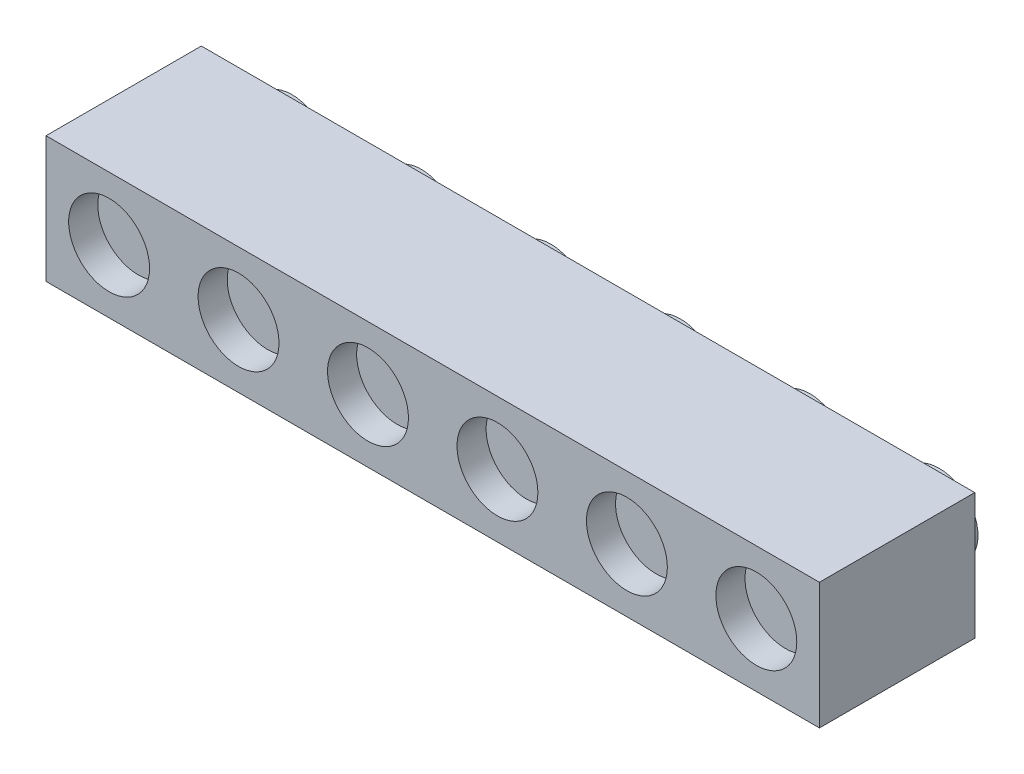
ISO-10303-21;
HEADER;
FILE_DESCRIPTION(('STEP AP214'),'2;1');
FILE_NAME('part.step','',(''),(''),'','','');
FILE_SCHEMA(('AUTOMOTIVE_DESIGN { 1 0 10303 214 1 1 1 1 }'));
ENDSEC;
DATA;
#1=APPLICATION_CONTEXT('core data for automotive mechanical design processes');
#2=APPLICATION_PROTOCOL_DEFINITION('international standard','automotive_design',2000,#1);
#3=PRODUCT_CONTEXT('',#1,'mechanical');
#4=PRODUCT('Part','Part','',(#3));
#5=PRODUCT_RELATED_PRODUCT_CATEGORY('part','',(#4));
#6=PRODUCT_DEFINITION_FORMATION('','',#4);
#7=PRODUCT_DEFINITION_CONTEXT('part definition',#1,'design');
#8=PRODUCT_DEFINITION('design','',#6,#7);
#9=PRODUCT_DEFINITION_SHAPE('','',#8);
#10=(LENGTH_UNIT() NAMED_UNIT(*) SI_UNIT(.MILLI.,.METRE.));
#11=(NAMED_UNIT(*) PLANE_ANGLE_UNIT() SI_UNIT($,.RADIAN.));
#12=(NAMED_UNIT(*) SI_UNIT($,.STERADIAN.) SOLID_ANGLE_UNIT());
#13=UNCERTAINTY_MEASURE_WITH_UNIT(LENGTH_MEASURE(1.E-05),#10,'distance_accuracy_value','');
#14=(GEOMETRIC_REPRESENTATION_CONTEXT(3) GLOBAL_UNCERTAINTY_ASSIGNED_CONTEXT((#13)) GLOBAL_UNIT_ASSIGNED_CONTEXT((#10,
#11,#12)) REPRESENTATION_CONTEXT('',''));
#15=CARTESIAN_POINT('',(0.,0.,0.));
#16=DIRECTION('',(0.,0.,1.));
#17=DIRECTION('',(1.,0.,0.));
#18=AXIS2_PLACEMENT_3D('',#15,#16,#17);
#19=CARTESIAN_POINT('',(-23.9,-3.9,9.6));
#20=DIRECTION('',(1.,0.,0.));
#21=DIRECTION('',(0.,0.,-1.));
#22=AXIS2_PLACEMENT_3D('',#19,#20,#21);
#23=PLANE('',#22);
#24=DIRECTION('',(0.,-1.,0.));
#25=VECTOR('',#24,1.);
#26=CARTESIAN_POINT('',(-23.9,-3.9,0.));
#27=LINE('',#26,#25);
#28=CARTESIAN_POINT('',(-23.9,3.9,0.));
#29=VERTEX_POINT('',#28);
#30=CARTESIAN_POINT('',(-23.9,-3.9,0.));
#31=VERTEX_POINT('',#30);
#32=EDGE_CURVE('E104',#29,#31,#27,.T.);
#33=ORIENTED_EDGE('',*,*,#32,.T.);
#34=DIRECTION('',(0.,0.,-1.));
#35=VECTOR('',#34,1.);
#36=CARTESIAN_POINT('',(-23.9,-3.9,9.6));
#37=LINE('',#36,#35);
#38=CARTESIAN_POINT('',(-23.9,-3.9,9.6));
#39=VERTEX_POINT('',#38);
#40=EDGE_CURVE('E95',#39,#31,#37,.T.);
#41=ORIENTED_EDGE('',*,*,#40,.F.);
#42=DIRECTION('',(0.,-1.,0.));
#43=VECTOR('',#42,1.);
#44=CARTESIAN_POINT('',(-23.9,-3.9,9.6));
#45=LINE('',#44,#43);
#46=CARTESIAN_POINT('',(-23.9,3.9,9.6));
#47=VERTEX_POINT('',#46);
#48=EDGE_CURVE('E89',#47,#39,#45,.T.);
#49=ORIENTED_EDGE('',*,*,#48,.F.);
#50=DIRECTION('',(0.,0.,-1.));
#51=VECTOR('',#50,1.);
#52=CARTESIAN_POINT('',(-23.9,3.9,9.6));
#53=LINE('',#52,#51);
#54=EDGE_CURVE('E100',#47,#29,#53,.T.);
#55=ORIENTED_EDGE('',*,*,#54,.T.);
#56=EDGE_LOOP('',(#33,#41,#49,#55));
#57=FACE_BOUND('',#56,.T.);
#58=ADVANCED_FACE('F37',(#57),#23,.F.);
#59=CARTESIAN_POINT('',(23.9,-3.9,9.6));
#60=DIRECTION('',(0.,1.,0.));
#61=DIRECTION('',(-1.,0.,0.));
#62=AXIS2_PLACEMENT_3D('',#59,#60,#61);
#63=PLANE('',#62);
#64=DIRECTION('',(1.,0.,0.));
#65=VECTOR('',#64,1.);
#66=CARTESIAN_POINT('',(23.9,-3.9,0.));
#67=LINE('',#66,#65);
#68=CARTESIAN_POINT('',(23.9,-3.9,0.));
#69=VERTEX_POINT('',#68);
#70=EDGE_CURVE('E94',#31,#69,#67,.T.);
#71=ORIENTED_EDGE('',*,*,#70,.T.);
#72=DIRECTION('',(0.,0.,-1.));
#73=VECTOR('',#72,1.);
#74=CARTESIAN_POINT('',(23.9,-3.9,9.6));
#75=LINE('',#74,#73);
#76=CARTESIAN_POINT('',(23.9,-3.9,9.6));
#77=VERTEX_POINT('',#76);
#78=EDGE_CURVE('E92',#77,#69,#75,.T.);
#79=ORIENTED_EDGE('',*,*,#78,.F.);
#80=DIRECTION('',(1.,0.,0.));
#81=VECTOR('',#80,1.);
#82=CARTESIAN_POINT('',(23.9,-3.9,9.6));
#83=LINE('',#82,#81);
#84=EDGE_CURVE('E84',#39,#77,#83,.T.);
#85=ORIENTED_EDGE('',*,*,#84,.F.);
#86=ORIENTED_EDGE('',*,*,#40,.T.);
#87=EDGE_LOOP('',(#71,#79,#85,#86));
#88=FACE_BOUND('',#87,.T.);
#89=ADVANCED_FACE('F93',(#88),#63,.F.);
#90=CARTESIAN_POINT('',(23.9,-3.9,9.6));
#91=DIRECTION('',(-1.,0.,0.));
#92=DIRECTION('',(0.,0.,1.));
#93=AXIS2_PLACEMENT_3D('',#90,#91,#92);
#94=PLANE('',#93);
#95=DIRECTION('',(0.,1.,0.));
#96=VECTOR('',#95,1.);
#97=CARTESIAN_POINT('',(23.9,-3.9,0.));
#98=LINE('',#97,#96);
#99=CARTESIAN_POINT('',(23.9,3.9,0.));
#100=VERTEX_POINT('',#99);
#101=EDGE_CURVE('E70',#69,#100,#98,.T.);
#102=ORIENTED_EDGE('',*,*,#101,.T.);
#103=DIRECTION('',(0.,0.,-1.));
#104=VECTOR('',#103,1.);
#105=CARTESIAN_POINT('',(23.9,3.9,9.6));
#106=LINE('',#105,#104);
#107=CARTESIAN_POINT('',(23.9,3.9,9.6));
#108=VERTEX_POINT('',#107);
#109=EDGE_CURVE('E96',#108,#100,#106,.T.);
#110=ORIENTED_EDGE('',*,*,#109,.F.);
#111=DIRECTION('',(0.,1.,0.));
#112=VECTOR('',#111,1.);
#113=CARTESIAN_POINT('',(23.9,-3.9,9.6));
#114=LINE('',#113,#112);
#115=EDGE_CURVE('E87',#77,#108,#114,.T.);
#116=ORIENTED_EDGE('',*,*,#115,.F.);
#117=ORIENTED_EDGE('',*,*,#78,.T.);
#118=EDGE_LOOP('',(#102,#110,#116,#117));
#119=FACE_BOUND('',#118,.T.);
#120=ADVANCED_FACE('F98',(#119),#94,.F.);
#121=CARTESIAN_POINT('',(23.9,3.9,9.6));
#122=DIRECTION('',(0.,-1.,0.));
#123=DIRECTION('',(1.,0.,0.));
#124=AXIS2_PLACEMENT_3D('',#121,#122,#123);
#125=PLANE('',#124);
#126=DIRECTION('',(-1.,0.,0.));
#127=VECTOR('',#126,1.);
#128=CARTESIAN_POINT('',(23.9,3.9,0.));
#129=LINE('',#128,#127);
#130=EDGE_CURVE('E76',#100,#29,#129,.T.);
#131=ORIENTED_EDGE('',*,*,#130,.T.);
#132=ORIENTED_EDGE('',*,*,#54,.F.);
#133=DIRECTION('',(-1.,0.,0.));
#134=VECTOR('',#133,1.);
#135=CARTESIAN_POINT('',(23.9,3.9,9.6));
#136=LINE('',#135,#134);
#137=EDGE_CURVE('E53',#108,#47,#136,.T.);
#138=ORIENTED_EDGE('',*,*,#137,.F.);
#139=ORIENTED_EDGE('',*,*,#109,.T.);
#140=EDGE_LOOP('',(#131,#132,#138,#139));
#141=FACE_BOUND('',#140,.T.);
#142=ADVANCED_FACE('F146',(#141),#125,.F.);
#143=CARTESIAN_POINT('',(0.,0.,9.6));
#144=DIRECTION('',(0.,0.,1.));
#145=DIRECTION('',(1.,0.,0.));
#146=AXIS2_PLACEMENT_3D('',#143,#144,#145);
#147=PLANE('',#146);
#148=CARTESIAN_POINT('',(-20.,0.,9.6));
#149=DIRECTION('',(0.,0.,1.));
#150=DIRECTION('',(1.,0.,0.));
#151=AXIS2_PLACEMENT_3D('',#148,#149,#150);
#152=CIRCLE('',#151,2.5);
#153=CARTESIAN_POINT('',(-17.5,0.,9.6));
#154=VERTEX_POINT('',#153);
#155=EDGE_CURVE('E428',#154,#154,#152,.T.);
#156=ORIENTED_EDGE('',*,*,#155,.F.);
#157=EDGE_LOOP('',(#156));
#158=FACE_BOUND('',#157,.T.);
#159=CARTESIAN_POINT('',(-12.,0.,9.6));
#160=DIRECTION('',(0.,0.,1.));
#161=DIRECTION('',(1.,0.,0.));
#162=AXIS2_PLACEMENT_3D('',#159,#160,#161);
#163=CIRCLE('',#162,2.5);
#164=CARTESIAN_POINT('',(-9.5,0.,9.6));
#165=VERTEX_POINT('',#164);
#166=EDGE_CURVE('E439',#165,#165,#163,.T.);
#167=ORIENTED_EDGE('',*,*,#166,.F.);
#168=EDGE_LOOP('',(#167));
#169=FACE_BOUND('',#168,.T.);
#170=CARTESIAN_POINT('',(-4.,0.,9.6));
#171=DIRECTION('',(0.,0.,1.));
#172=DIRECTION('',(1.,0.,0.));
#173=AXIS2_PLACEMENT_3D('',#170,#171,#172);
#174=CIRCLE('',#173,2.5);
#175=CARTESIAN_POINT('',(-1.5,0.,9.6));
#176=VERTEX_POINT('',#175);
#177=EDGE_CURVE('E445',#176,#176,#174,.T.);
#178=ORIENTED_EDGE('',*,*,#177,.F.);
#179=EDGE_LOOP('',(#178));
#180=FACE_BOUND('',#179,.T.);
#181=CARTESIAN_POINT('',(4.,0.,9.6));
#182=DIRECTION('',(0.,0.,1.));
#183=DIRECTION('',(1.,0.,0.));
#184=AXIS2_PLACEMENT_3D('',#181,#182,#183);
#185=CIRCLE('',#184,2.5);
#186=CARTESIAN_POINT('',(6.5,0.,9.6));
#187=VERTEX_POINT('',#186);
#188=EDGE_CURVE('E451',#187,#187,#185,.T.);
#189=ORIENTED_EDGE('',*,*,#188,.F.);
#190=EDGE_LOOP('',(#189));
#191=FACE_BOUND('',#190,.T.);
#192=CARTESIAN_POINT('',(12.,0.,9.6));
#193=DIRECTION('',(0.,0.,1.));
#194=DIRECTION('',(1.,0.,0.));
#195=AXIS2_PLACEMENT_3D('',#192,#193,#194);
#196=CIRCLE('',#195,2.5);
#197=CARTESIAN_POINT('',(14.5,0.,9.6));
#198=VERTEX_POINT('',#197);
#199=EDGE_CURVE('E457',#198,#198,#196,.T.);
#200=ORIENTED_EDGE('',*,*,#199,.F.);
#201=EDGE_LOOP('',(#200));
#202=FACE_BOUND('',#201,.T.);
#203=CARTESIAN_POINT('',(20.,0.,9.6));
#204=DIRECTION('',(0.,0.,1.));
#205=DIRECTION('',(1.,0.,0.));
#206=AXIS2_PLACEMENT_3D('',#203,#204,#205);
#207=CIRCLE('',#206,2.5);
#208=CARTESIAN_POINT('',(22.5,0.,9.6));
#209=VERTEX_POINT('',#208);
#210=EDGE_CURVE('E463',#209,#209,#207,.T.);
#211=ORIENTED_EDGE('',*,*,#210,.F.);
#212=EDGE_LOOP('',(#211));
#213=FACE_BOUND('',#212,.T.);
#214=ORIENTED_EDGE('',*,*,#48,.T.);
#215=ORIENTED_EDGE('',*,*,#84,.T.);
#216=ORIENTED_EDGE('',*,*,#115,.T.);
#217=ORIENTED_EDGE('',*,*,#137,.T.);
#218=EDGE_LOOP('',(#214,#215,#216,#217));
#219=FACE_BOUND('',#218,.T.);
#220=ADVANCED_FACE('F85',(#158,#169,#180,#191,#202,#213,#219),#147,.T.);
#221=CARTESIAN_POINT('',(0.,0.,0.));
#222=DIRECTION('',(0.,0.,1.));
#223=DIRECTION('',(1.,0.,0.));
#224=AXIS2_PLACEMENT_3D('',#221,#222,#223);
#225=PLANE('',#224);
#226=CARTESIAN_POINT('',(-20.,0.,0.));
#227=DIRECTION('',(0.,0.,1.));
#228=DIRECTION('',(1.,0.,0.));
#229=AXIS2_PLACEMENT_3D('',#226,#227,#228);
#230=CIRCLE('',#229,2.4);
#231=CARTESIAN_POINT('',(-17.6,0.,0.));
#232=VERTEX_POINT('',#231);
#233=EDGE_CURVE('E11',#232,#232,#230,.F.);
#234=ORIENTED_EDGE('',*,*,#233,.F.);
#235=EDGE_LOOP('',(#234));
#236=FACE_BOUND('',#235,.T.);
#237=CARTESIAN_POINT('',(-12.,0.,0.));
#238=DIRECTION('',(0.,0.,1.));
#239=DIRECTION('',(1.,0.,0.));
#240=AXIS2_PLACEMENT_3D('',#237,#238,#239);
#241=CIRCLE('',#240,2.4);
#242=CARTESIAN_POINT('',(-9.60000000000001,0.,0.));
#243=VERTEX_POINT('',#242);
#244=EDGE_CURVE('E45',#243,#243,#241,.F.);
#245=ORIENTED_EDGE('',*,*,#244,.F.);
#246=EDGE_LOOP('',(#245));
#247=FACE_BOUND('',#246,.T.);
#248=CARTESIAN_POINT('',(-4.00000000000001,0.,0.));
#249=DIRECTION('',(0.,0.,1.));
#250=DIRECTION('',(1.,0.,0.));
#251=AXIS2_PLACEMENT_3D('',#248,#249,#250);
#252=CIRCLE('',#251,2.4);
#253=CARTESIAN_POINT('',(-1.60000000000001,0.,0.));
#254=VERTEX_POINT('',#253);
#255=EDGE_CURVE('E123',#254,#254,#252,.F.);
#256=ORIENTED_EDGE('',*,*,#255,.F.);
#257=EDGE_LOOP('',(#256));
#258=FACE_BOUND('',#257,.T.);
#259=CARTESIAN_POINT('',(3.99999999999999,0.,0.));
#260=DIRECTION('',(0.,0.,1.));
#261=DIRECTION('',(1.,0.,0.));
#262=AXIS2_PLACEMENT_3D('',#259,#260,#261);
#263=CIRCLE('',#262,2.4);
#264=CARTESIAN_POINT('',(6.39999999999999,0.,0.));
#265=VERTEX_POINT('',#264);
#266=EDGE_CURVE('E120',#265,#265,#263,.F.);
#267=ORIENTED_EDGE('',*,*,#266,.F.);
#268=EDGE_LOOP('',(#267));
#269=FACE_BOUND('',#268,.T.);
#270=CARTESIAN_POINT('',(12.,0.,0.));
#271=DIRECTION('',(0.,0.,1.));
#272=DIRECTION('',(1.,0.,0.));
#273=AXIS2_PLACEMENT_3D('',#270,#271,#272);
#274=CIRCLE('',#273,2.4);
#275=CARTESIAN_POINT('',(14.4,0.,0.));
#276=VERTEX_POINT('',#275);
#277=EDGE_CURVE('E117',#276,#276,#274,.F.);
#278=ORIENTED_EDGE('',*,*,#277,.F.);
#279=EDGE_LOOP('',(#278));
#280=FACE_BOUND('',#279,.T.);
#281=CARTESIAN_POINT('',(20.,0.,0.));
#282=DIRECTION('',(0.,0.,1.));
#283=DIRECTION('',(1.,0.,0.));
#284=AXIS2_PLACEMENT_3D('',#281,#282,#283);
#285=CIRCLE('',#284,2.4);
#286=CARTESIAN_POINT('',(22.4,0.,0.));
#287=VERTEX_POINT('',#286);
#288=EDGE_CURVE('E114',#287,#287,#285,.F.);
#289=ORIENTED_EDGE('',*,*,#288,.F.);
#290=EDGE_LOOP('',(#289));
#291=FACE_BOUND('',#290,.T.);
#292=ORIENTED_EDGE('',*,*,#32,.F.);
#293=ORIENTED_EDGE('',*,*,#130,.F.);
#294=ORIENTED_EDGE('',*,*,#101,.F.);
#295=ORIENTED_EDGE('',*,*,#70,.F.);
#296=EDGE_LOOP('',(#292,#293,#294,#295));
#297=FACE_BOUND('',#296,.T.);
#298=ADVANCED_FACE('F130',(#236,#247,#258,#269,#280,#291,#297),#225,.F.);
#299=CARTESIAN_POINT('',(20.,0.,-1.7));
#300=DIRECTION('',(0.,0.,1.));
#301=DIRECTION('',(1.,0.,0.));
#302=AXIS2_PLACEMENT_3D('',#299,#300,#301);
#303=CYLINDRICAL_SURFACE('',#302,2.4);
#304=CARTESIAN_POINT('',(20.,0.,-1.7));
#305=DIRECTION('',(0.,0.,-1.));
#306=DIRECTION('',(-1.,0.,0.));
#307=AXIS2_PLACEMENT_3D('',#304,#305,#306);
#308=CIRCLE('',#307,2.4);
#309=CARTESIAN_POINT('',(17.6,0.,-1.7));
#310=VERTEX_POINT('',#309);
#311=EDGE_CURVE('E107',#310,#310,#308,.T.);
#312=ORIENTED_EDGE('',*,*,#311,.F.);
#313=EDGE_LOOP('',(#312));
#314=FACE_BOUND('',#313,.T.);
#315=ORIENTED_EDGE('',*,*,#288,.T.);
#316=EDGE_LOOP('',(#315));
#317=FACE_BOUND('',#316,.T.);
#318=ADVANCED_FACE('F133',(#314,#317),#303,.T.);
#319=CARTESIAN_POINT('',(20.,0.,-1.7));
#320=DIRECTION('',(0.,0.,-1.));
#321=DIRECTION('',(-1.,0.,0.));
#322=AXIS2_PLACEMENT_3D('',#319,#320,#321);
#323=PLANE('',#322);
#324=ORIENTED_EDGE('',*,*,#311,.T.);
#325=EDGE_LOOP('',(#324));
#326=FACE_BOUND('',#325,.T.);
#327=ADVANCED_FACE('F186',(#326),#323,.T.);
#328=CARTESIAN_POINT('',(12.,0.,-1.7));
#329=DIRECTION('',(0.,0.,1.));
#330=DIRECTION('',(1.,0.,0.));
#331=AXIS2_PLACEMENT_3D('',#328,#329,#330);
#332=CYLINDRICAL_SURFACE('',#331,2.4);
#333=CARTESIAN_POINT('',(12.,0.,-1.7));
#334=DIRECTION('',(0.,0.,-1.));
#335=DIRECTION('',(-1.,0.,0.));
#336=AXIS2_PLACEMENT_3D('',#333,#334,#335);
#337=CIRCLE('',#336,2.4);
#338=CARTESIAN_POINT('',(9.59999999999999,0.,-1.7));
#339=VERTEX_POINT('',#338);
#340=EDGE_CURVE('E474',#339,#339,#337,.T.);
#341=ORIENTED_EDGE('',*,*,#340,.F.);
#342=EDGE_LOOP('',(#341));
#343=FACE_BOUND('',#342,.T.);
#344=ORIENTED_EDGE('',*,*,#277,.T.);
#345=EDGE_LOOP('',(#344));
#346=FACE_BOUND('',#345,.T.);
#347=ADVANCED_FACE('F196',(#343,#346),#332,.T.);
#348=CARTESIAN_POINT('',(12.,0.,-1.7));
#349=DIRECTION('',(0.,0.,-1.));
#350=DIRECTION('',(-1.,0.,0.));
#351=AXIS2_PLACEMENT_3D('',#348,#349,#350);
#352=PLANE('',#351);
#353=ORIENTED_EDGE('',*,*,#340,.T.);
#354=EDGE_LOOP('',(#353));
#355=FACE_BOUND('',#354,.T.);
#356=ADVANCED_FACE('F206',(#355),#352,.T.);
#357=CARTESIAN_POINT('',(3.99999999999999,0.,-1.7));
#358=DIRECTION('',(0.,0.,1.));
#359=DIRECTION('',(1.,0.,0.));
#360=AXIS2_PLACEMENT_3D('',#357,#358,#359);
#361=CYLINDRICAL_SURFACE('',#360,2.4);
#362=CARTESIAN_POINT('',(3.99999999999999,0.,-1.7));
#363=DIRECTION('',(0.,0.,-1.));
#364=DIRECTION('',(-1.,0.,0.));
#365=AXIS2_PLACEMENT_3D('',#362,#363,#364);
#366=CIRCLE('',#365,2.4);
#367=CARTESIAN_POINT('',(1.59999999999999,0.,-1.7));
#368=VERTEX_POINT('',#367);
#369=EDGE_CURVE('E471',#368,#368,#366,.T.);
#370=ORIENTED_EDGE('',*,*,#369,.F.);
#371=EDGE_LOOP('',(#370));
#372=FACE_BOUND('',#371,.T.);
#373=ORIENTED_EDGE('',*,*,#266,.T.);
#374=EDGE_LOOP('',(#373));
#375=FACE_BOUND('',#374,.T.);
#376=ADVANCED_FACE('F216',(#372,#375),#361,.T.);
#377=CARTESIAN_POINT('',(3.99999999999999,0.,-1.7));
#378=DIRECTION('',(0.,0.,-1.));
#379=DIRECTION('',(-1.,0.,0.));
#380=AXIS2_PLACEMENT_3D('',#377,#378,#379);
#381=PLANE('',#380);
#382=ORIENTED_EDGE('',*,*,#369,.T.);
#383=EDGE_LOOP('',(#382));
#384=FACE_BOUND('',#383,.T.);
#385=ADVANCED_FACE('F226',(#384),#381,.T.);
#386=CARTESIAN_POINT('',(-4.00000000000001,0.,-1.7));
#387=DIRECTION('',(0.,0.,1.));
#388=DIRECTION('',(1.,0.,0.));
#389=AXIS2_PLACEMENT_3D('',#386,#387,#388);
#390=CYLINDRICAL_SURFACE('',#389,2.4);
#391=CARTESIAN_POINT('',(-4.00000000000001,0.,-1.7));
#392=DIRECTION('',(0.,0.,-1.));
#393=DIRECTION('',(-1.,0.,0.));
#394=AXIS2_PLACEMENT_3D('',#391,#392,#393);
#395=CIRCLE('',#394,2.4);
#396=CARTESIAN_POINT('',(-6.40000000000001,0.,-1.7));
#397=VERTEX_POINT('',#396);
#398=EDGE_CURVE('E468',#397,#397,#395,.T.);
#399=ORIENTED_EDGE('',*,*,#398,.F.);
#400=EDGE_LOOP('',(#399));
#401=FACE_BOUND('',#400,.T.);
#402=ORIENTED_EDGE('',*,*,#255,.T.);
#403=EDGE_LOOP('',(#402));
#404=FACE_BOUND('',#403,.T.);
#405=ADVANCED_FACE('F236',(#401,#404),#390,.T.);
#406=CARTESIAN_POINT('',(-4.00000000000001,0.,-1.7));
#407=DIRECTION('',(0.,0.,-1.));
#408=DIRECTION('',(-1.,0.,0.));
#409=AXIS2_PLACEMENT_3D('',#406,#407,#408);
#410=PLANE('',#409);
#411=ORIENTED_EDGE('',*,*,#398,.T.);
#412=EDGE_LOOP('',(#411));
#413=FACE_BOUND('',#412,.T.);
#414=ADVANCED_FACE('F246',(#413),#410,.T.);
#415=CARTESIAN_POINT('',(-12.,0.,-1.7));
#416=DIRECTION('',(0.,0.,1.));
#417=DIRECTION('',(1.,0.,0.));
#418=AXIS2_PLACEMENT_3D('',#415,#416,#417);
#419=CYLINDRICAL_SURFACE('',#418,2.4);
#420=CARTESIAN_POINT('',(-12.,0.,-1.7));
#421=DIRECTION('',(0.,0.,-1.));
#422=DIRECTION('',(-1.,0.,0.));
#423=AXIS2_PLACEMENT_3D('',#420,#421,#422);
#424=CIRCLE('',#423,2.4);
#425=CARTESIAN_POINT('',(-14.4,0.,-1.7));
#426=VERTEX_POINT('',#425);
#427=EDGE_CURVE('E431',#426,#426,#424,.T.);
#428=ORIENTED_EDGE('',*,*,#427,.F.);
#429=EDGE_LOOP('',(#428));
#430=FACE_BOUND('',#429,.T.);
#431=ORIENTED_EDGE('',*,*,#244,.T.);
#432=EDGE_LOOP('',(#431));
#433=FACE_BOUND('',#432,.T.);
#434=ADVANCED_FACE('F128',(#430,#433),#419,.T.);
#435=CARTESIAN_POINT('',(-12.,0.,-1.7));
#436=DIRECTION('',(0.,0.,-1.));
#437=DIRECTION('',(-1.,0.,0.));
#438=AXIS2_PLACEMENT_3D('',#435,#436,#437);
#439=PLANE('',#438);
#440=ORIENTED_EDGE('',*,*,#427,.T.);
#441=EDGE_LOOP('',(#440));
#442=FACE_BOUND('',#441,.T.);
#443=ADVANCED_FACE('F265',(#442),#439,.T.);
#444=CARTESIAN_POINT('',(-20.,0.,-1.7));
#445=DIRECTION('',(0.,0.,1.));
#446=DIRECTION('',(1.,0.,0.));
#447=AXIS2_PLACEMENT_3D('',#444,#445,#446);
#448=CYLINDRICAL_SURFACE('',#447,2.4);
#449=CARTESIAN_POINT('',(-20.,0.,-1.7));
#450=DIRECTION('',(0.,0.,-1.));
#451=DIRECTION('',(-1.,0.,0.));
#452=AXIS2_PLACEMENT_3D('',#449,#450,#451);
#453=CIRCLE('',#452,2.4);
#454=CARTESIAN_POINT('',(-22.4,0.,-1.7));
#455=VERTEX_POINT('',#454);
#456=EDGE_CURVE('E427',#455,#455,#453,.T.);
#457=ORIENTED_EDGE('',*,*,#456,.F.);
#458=EDGE_LOOP('',(#457));
#459=FACE_BOUND('',#458,.T.);
#460=ORIENTED_EDGE('',*,*,#233,.T.);
#461=EDGE_LOOP('',(#460));
#462=FACE_BOUND('',#461,.T.);
#463=ADVANCED_FACE('F275',(#459,#462),#448,.T.);
#464=CARTESIAN_POINT('',(-20.,0.,-1.7));
#465=DIRECTION('',(0.,0.,-1.));
#466=DIRECTION('',(-1.,0.,0.));
#467=AXIS2_PLACEMENT_3D('',#464,#465,#466);
#468=PLANE('',#467);
#469=ORIENTED_EDGE('',*,*,#456,.T.);
#470=EDGE_LOOP('',(#469));
#471=FACE_BOUND('',#470,.T.);
#472=ADVANCED_FACE('F285',(#471),#468,.T.);
#473=CARTESIAN_POINT('',(20.,0.,7.8));
#474=DIRECTION('',(0.,0.,1.));
#475=DIRECTION('',(1.,0.,0.));
#476=AXIS2_PLACEMENT_3D('',#473,#474,#475);
#477=CYLINDRICAL_SURFACE('',#476,2.5);
#478=CARTESIAN_POINT('',(20.,0.,7.8));
#479=DIRECTION('',(0.,0.,1.));
#480=DIRECTION('',(1.,0.,0.));
#481=AXIS2_PLACEMENT_3D('',#478,#479,#480);
#482=CIRCLE('',#481,2.5);
#483=CARTESIAN_POINT('',(22.5,0.,7.8));
#484=VERTEX_POINT('',#483);
#485=EDGE_CURVE('E460',#484,#484,#482,.T.);
#486=ORIENTED_EDGE('',*,*,#485,.F.);
#487=EDGE_LOOP('',(#486));
#488=FACE_BOUND('',#487,.T.);
#489=ORIENTED_EDGE('',*,*,#210,.T.);
#490=EDGE_LOOP('',(#489));
#491=FACE_BOUND('',#490,.T.);
#492=ADVANCED_FACE('F295',(#488,#491),#477,.F.);
#493=CARTESIAN_POINT('',(20.,0.,7.8));
#494=DIRECTION('',(0.,0.,1.));
#495=DIRECTION('',(1.,0.,0.));
#496=AXIS2_PLACEMENT_3D('',#493,#494,#495);
#497=PLANE('',#496);
#498=ORIENTED_EDGE('',*,*,#485,.T.);
#499=EDGE_LOOP('',(#498));
#500=FACE_BOUND('',#499,.T.);
#501=ADVANCED_FACE('F310',(#500),#497,.T.);
#502=CARTESIAN_POINT('',(12.,0.,7.8));
#503=DIRECTION('',(0.,0.,1.));
#504=DIRECTION('',(1.,0.,0.));
#505=AXIS2_PLACEMENT_3D('',#502,#503,#504);
#506=CYLINDRICAL_SURFACE('',#505,2.5);
#507=CARTESIAN_POINT('',(12.,0.,7.8));
#508=DIRECTION('',(0.,0.,1.));
#509=DIRECTION('',(1.,0.,0.));
#510=AXIS2_PLACEMENT_3D('',#507,#508,#509);
#511=CIRCLE('',#510,2.5);
#512=CARTESIAN_POINT('',(14.5,0.,7.8));
#513=VERTEX_POINT('',#512);
#514=EDGE_CURVE('E454',#513,#513,#511,.T.);
#515=ORIENTED_EDGE('',*,*,#514,.F.);
#516=EDGE_LOOP('',(#515));
#517=FACE_BOUND('',#516,.T.);
#518=ORIENTED_EDGE('',*,*,#199,.T.);
#519=EDGE_LOOP('',(#518));
#520=FACE_BOUND('',#519,.T.);
#521=ADVANCED_FACE('F320',(#517,#520),#506,.F.);
#522=CARTESIAN_POINT('',(12.,0.,7.8));
#523=DIRECTION('',(0.,0.,1.));
#524=DIRECTION('',(1.,0.,0.));
#525=AXIS2_PLACEMENT_3D('',#522,#523,#524);
#526=PLANE('',#525);
#527=ORIENTED_EDGE('',*,*,#514,.T.);
#528=EDGE_LOOP('',(#527));
#529=FACE_BOUND('',#528,.T.);
#530=ADVANCED_FACE('F330',(#529),#526,.T.);
#531=CARTESIAN_POINT('',(4.,0.,7.8));
#532=DIRECTION('',(0.,0.,1.));
#533=DIRECTION('',(1.,0.,0.));
#534=AXIS2_PLACEMENT_3D('',#531,#532,#533);
#535=CYLINDRICAL_SURFACE('',#534,2.5);
#536=CARTESIAN_POINT('',(4.,0.,7.8));
#537=DIRECTION('',(0.,0.,1.));
#538=DIRECTION('',(1.,0.,0.));
#539=AXIS2_PLACEMENT_3D('',#536,#537,#538);
#540=CIRCLE('',#539,2.5);
#541=CARTESIAN_POINT('',(6.5,0.,7.8));
#542=VERTEX_POINT('',#541);
#543=EDGE_CURVE('E448',#542,#542,#540,.T.);
#544=ORIENTED_EDGE('',*,*,#543,.F.);
#545=EDGE_LOOP('',(#544));
#546=FACE_BOUND('',#545,.T.);
#547=ORIENTED_EDGE('',*,*,#188,.T.);
#548=EDGE_LOOP('',(#547));
#549=FACE_BOUND('',#548,.T.);
#550=ADVANCED_FACE('F340',(#546,#549),#535,.F.);
#551=CARTESIAN_POINT('',(4.,0.,7.8));
#552=DIRECTION('',(0.,0.,1.));
#553=DIRECTION('',(1.,0.,0.));
#554=AXIS2_PLACEMENT_3D('',#551,#552,#553);
#555=PLANE('',#554);
#556=ORIENTED_EDGE('',*,*,#543,.T.);
#557=EDGE_LOOP('',(#556));
#558=FACE_BOUND('',#557,.T.);
#559=ADVANCED_FACE('F350',(#558),#555,.T.);
#560=CARTESIAN_POINT('',(-4.,0.,7.8));
#561=DIRECTION('',(0.,0.,1.));
#562=DIRECTION('',(1.,0.,0.));
#563=AXIS2_PLACEMENT_3D('',#560,#561,#562);
#564=CYLINDRICAL_SURFACE('',#563,2.5);
#565=CARTESIAN_POINT('',(-4.,0.,7.8));
#566=DIRECTION('',(0.,0.,1.));
#567=DIRECTION('',(1.,0.,0.));
#568=AXIS2_PLACEMENT_3D('',#565,#566,#567);
#569=CIRCLE('',#568,2.5);
#570=CARTESIAN_POINT('',(-1.5,0.,7.8));
#571=VERTEX_POINT('',#570);
#572=EDGE_CURVE('E442',#571,#571,#569,.T.);
#573=ORIENTED_EDGE('',*,*,#572,.F.);
#574=EDGE_LOOP('',(#573));
#575=FACE_BOUND('',#574,.T.);
#576=ORIENTED_EDGE('',*,*,#177,.T.);
#577=EDGE_LOOP('',(#576));
#578=FACE_BOUND('',#577,.T.);
#579=ADVANCED_FACE('F360',(#575,#578),#564,.F.);
#580=CARTESIAN_POINT('',(-4.,0.,7.8));
#581=DIRECTION('',(0.,0.,1.));
#582=DIRECTION('',(1.,0.,0.));
#583=AXIS2_PLACEMENT_3D('',#580,#581,#582);
#584=PLANE('',#583);
#585=ORIENTED_EDGE('',*,*,#572,.T.);
#586=EDGE_LOOP('',(#585));
#587=FACE_BOUND('',#586,.T.);
#588=ADVANCED_FACE('F370',(#587),#584,.T.);
#589=CARTESIAN_POINT('',(-12.,0.,7.8));
#590=DIRECTION('',(0.,0.,1.));
#591=DIRECTION('',(1.,0.,0.));
#592=AXIS2_PLACEMENT_3D('',#589,#590,#591);
#593=CYLINDRICAL_SURFACE('',#592,2.5);
#594=CARTESIAN_POINT('',(-12.,0.,7.8));
#595=DIRECTION('',(0.,0.,1.));
#596=DIRECTION('',(1.,0.,0.));
#597=AXIS2_PLACEMENT_3D('',#594,#595,#596);
#598=CIRCLE('',#597,2.5);
#599=CARTESIAN_POINT('',(-9.5,0.,7.8));
#600=VERTEX_POINT('',#599);
#601=EDGE_CURVE('E434',#600,#600,#598,.T.);
#602=ORIENTED_EDGE('',*,*,#601,.F.);
#603=EDGE_LOOP('',(#602));
#604=FACE_BOUND('',#603,.T.);
#605=ORIENTED_EDGE('',*,*,#166,.T.);
#606=EDGE_LOOP('',(#605));
#607=FACE_BOUND('',#606,.T.);
#608=ADVANCED_FACE('F380',(#604,#607),#593,.F.);
#609=CARTESIAN_POINT('',(-12.,0.,7.8));
#610=DIRECTION('',(0.,0.,1.));
#611=DIRECTION('',(1.,0.,0.));
#612=AXIS2_PLACEMENT_3D('',#609,#610,#611);
#613=PLANE('',#612);
#614=ORIENTED_EDGE('',*,*,#601,.T.);
#615=EDGE_LOOP('',(#614));
#616=FACE_BOUND('',#615,.T.);
#617=ADVANCED_FACE('F390',(#616),#613,.T.);
#618=CARTESIAN_POINT('',(-20.,0.,7.8));
#619=DIRECTION('',(0.,0.,1.));
#620=DIRECTION('',(1.,0.,0.));
#621=AXIS2_PLACEMENT_3D('',#618,#619,#620);
#622=CYLINDRICAL_SURFACE('',#621,2.5);
#623=CARTESIAN_POINT('',(-20.,0.,7.8));
#624=DIRECTION('',(0.,0.,1.));
#625=DIRECTION('',(1.,0.,0.));
#626=AXIS2_PLACEMENT_3D('',#623,#624,#625);
#627=CIRCLE('',#626,2.5);
#628=CARTESIAN_POINT('',(-17.5,0.,7.8));
#629=VERTEX_POINT('',#628);
#630=EDGE_CURVE('E426',#629,#629,#627,.T.);
#631=ORIENTED_EDGE('',*,*,#630,.F.);
#632=EDGE_LOOP('',(#631));
#633=FACE_BOUND('',#632,.T.);
#634=ORIENTED_EDGE('',*,*,#155,.T.);
#635=EDGE_LOOP('',(#634));
#636=FACE_BOUND('',#635,.T.);
#637=ADVANCED_FACE('F400',(#633,#636),#622,.F.);
#638=CARTESIAN_POINT('',(-20.,0.,7.8));
#639=DIRECTION('',(0.,0.,1.));
#640=DIRECTION('',(1.,0.,0.));
#641=AXIS2_PLACEMENT_3D('',#638,#639,#640);
#642=PLANE('',#641);
#643=ORIENTED_EDGE('',*,*,#630,.T.);
#644=EDGE_LOOP('',(#643));
#645=FACE_BOUND('',#644,.T.);
#646=ADVANCED_FACE('F410',(#645),#642,.T.);
#647=CLOSED_SHELL('',(#58,#89,#120,#142,#220,#298,#318,#327,#347,#356,#376,#385,#405,#414,#434,
#443,#463,#472,#492,#501,#521,#530,#550,#559,#579,#588,#608,#617,#637,#646));
#648=MANIFOLD_SOLID_BREP('B2',#647);
#649=ADVANCED_BREP_SHAPE_REPRESENTATION('',(#18,#648),#14);
#650=SHAPE_DEFINITION_REPRESENTATION(#9,#649);
ENDSEC;
END-ISO-10303-21;
